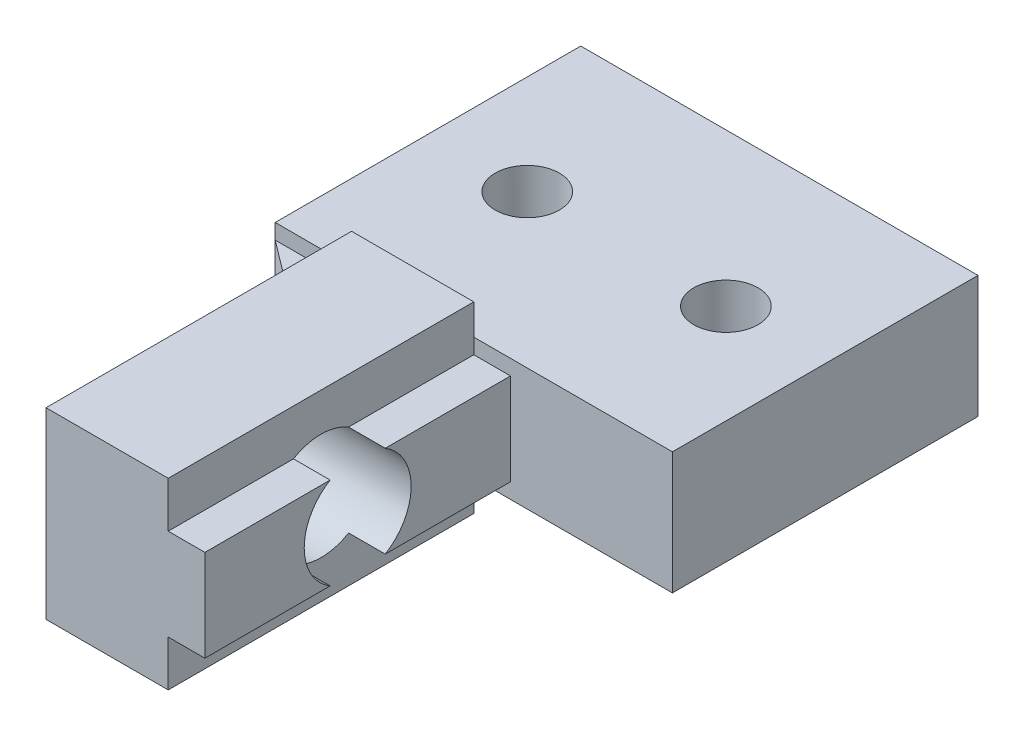
ISO-10303-21;
HEADER;
FILE_DESCRIPTION(('STEP AP214'),'2;1');
FILE_NAME('part.step','',(''),(''),'','','');
FILE_SCHEMA(('AUTOMOTIVE_DESIGN { 1 0 10303 214 1 1 1 1 }'));
ENDSEC;
DATA;
#1=APPLICATION_CONTEXT('core data for automotive mechanical design processes');
#2=APPLICATION_PROTOCOL_DEFINITION('international standard','automotive_design',2000,#1);
#3=PRODUCT_CONTEXT('',#1,'mechanical');
#4=PRODUCT('Part','Part','',(#3));
#5=PRODUCT_RELATED_PRODUCT_CATEGORY('part','',(#4));
#6=PRODUCT_DEFINITION_FORMATION('','',#4);
#7=PRODUCT_DEFINITION_CONTEXT('part definition',#1,'design');
#8=PRODUCT_DEFINITION('design','',#6,#7);
#9=PRODUCT_DEFINITION_SHAPE('','',#8);
#10=(LENGTH_UNIT() NAMED_UNIT(*) SI_UNIT(.MILLI.,.METRE.));
#11=(NAMED_UNIT(*) PLANE_ANGLE_UNIT() SI_UNIT($,.RADIAN.));
#12=(NAMED_UNIT(*) SI_UNIT($,.STERADIAN.) SOLID_ANGLE_UNIT());
#13=UNCERTAINTY_MEASURE_WITH_UNIT(LENGTH_MEASURE(1.E-05),#10,'distance_accuracy_value','');
#14=(GEOMETRIC_REPRESENTATION_CONTEXT(3) GLOBAL_UNCERTAINTY_ASSIGNED_CONTEXT((#13)) GLOBAL_UNIT_ASSIGNED_CONTEXT((#10,
#11,#12)) REPRESENTATION_CONTEXT('',''));
#15=CARTESIAN_POINT('',(0.,0.,0.));
#16=DIRECTION('',(0.,0.,1.));
#17=DIRECTION('',(1.,0.,0.));
#18=AXIS2_PLACEMENT_3D('',#15,#16,#17);
#19=CARTESIAN_POINT('',(-6.5,6.,5.));
#20=DIRECTION('',(0.,0.,-1.));
#21=DIRECTION('',(-1.,0.,0.));
#22=AXIS2_PLACEMENT_3D('',#19,#20,#21);
#23=PLANE('',#22);
#24=DIRECTION('',(-1.,0.,0.));
#25=VECTOR('',#24,1.);
#26=CARTESIAN_POINT('',(-6.5,4.5,5.));
#27=LINE('',#26,#25);
#28=CARTESIAN_POINT('',(-4.,4.5,5.));
#29=VERTEX_POINT('',#28);
#30=CARTESIAN_POINT('',(-6.5,4.5,5.));
#31=VERTEX_POINT('',#30);
#32=EDGE_CURVE('E195',#29,#31,#27,.T.);
#33=ORIENTED_EDGE('',*,*,#32,.F.);
#34=DIRECTION('',(0.,-1.,0.));
#35=VECTOR('',#34,1.);
#36=CARTESIAN_POINT('',(-4.,0.,5.));
#37=LINE('',#36,#35);
#38=CARTESIAN_POINT('',(-4.,5.,5.));
#39=VERTEX_POINT('',#38);
#40=EDGE_CURVE('E182',#39,#29,#37,.T.);
#41=ORIENTED_EDGE('',*,*,#40,.F.);
#42=DIRECTION('',(1.,0.,0.));
#43=VECTOR('',#42,1.);
#44=CARTESIAN_POINT('',(-6.5,5.,5.));
#45=LINE('',#44,#43);
#46=CARTESIAN_POINT('',(-6.5,5.,5.));
#47=VERTEX_POINT('',#46);
#48=EDGE_CURVE('E263',#47,#39,#45,.T.);
#49=ORIENTED_EDGE('',*,*,#48,.F.);
#50=DIRECTION('',(0.,-1.,0.));
#51=VECTOR('',#50,1.);
#52=CARTESIAN_POINT('',(-6.5,6.,5.));
#53=LINE('',#52,#51);
#54=EDGE_CURVE('E196',#47,#31,#53,.T.);
#55=ORIENTED_EDGE('',*,*,#54,.T.);
#56=EDGE_LOOP('',(#33,#41,#49,#55));
#57=FACE_BOUND('',#56,.T.);
#58=ADVANCED_FACE('F37',(#57),#23,.F.);
#59=CARTESIAN_POINT('',(1.2,1.5,15.));
#60=DIRECTION('',(0.,1.,0.));
#61=DIRECTION('',(-1.,0.,0.));
#62=AXIS2_PLACEMENT_3D('',#59,#60,#61);
#63=PLANE('',#62);
#64=DIRECTION('',(0.,0.,-1.));
#65=VECTOR('',#64,1.);
#66=CARTESIAN_POINT('',(1.2,1.5,15.));
#67=LINE('',#66,#65);
#68=CARTESIAN_POINT('',(1.2,1.5,9.09861218113401));
#69=VERTEX_POINT('',#68);
#70=CARTESIAN_POINT('',(1.2,1.5,5.));
#71=VERTEX_POINT('',#70);
#72=EDGE_CURVE('E321',#69,#71,#67,.T.);
#73=ORIENTED_EDGE('',*,*,#72,.F.);
#74=DIRECTION('',(-1.,0.,0.));
#75=VECTOR('',#74,1.);
#76=CARTESIAN_POINT('',(6.5,1.5,9.098612181134));
#77=LINE('',#76,#75);
#78=CARTESIAN_POINT('',(0.,1.5,9.098612181134));
#79=VERTEX_POINT('',#78);
#80=EDGE_CURVE('E231',#69,#79,#77,.T.);
#81=ORIENTED_EDGE('',*,*,#80,.T.);
#82=DIRECTION('',(0.,0.,-1.));
#83=VECTOR('',#82,1.);
#84=CARTESIAN_POINT('',(0.,1.5,15.));
#85=LINE('',#84,#83);
#86=CARTESIAN_POINT('',(0.,1.5,5.));
#87=VERTEX_POINT('',#86);
#88=EDGE_CURVE('E325',#79,#87,#85,.T.);
#89=ORIENTED_EDGE('',*,*,#88,.T.);
#90=DIRECTION('',(1.,0.,0.));
#91=VECTOR('',#90,1.);
#92=CARTESIAN_POINT('',(1.2,1.5,5.));
#93=LINE('',#92,#91);
#94=EDGE_CURVE('E299',#87,#71,#93,.T.);
#95=ORIENTED_EDGE('',*,*,#94,.T.);
#96=EDGE_LOOP('',(#73,#81,#89,#95));
#97=FACE_BOUND('',#96,.T.);
#98=ADVANCED_FACE('F410',(#97),#63,.F.);
#99=CARTESIAN_POINT('',(1.2,4.5,15.));
#100=DIRECTION('',(-1.,0.,0.));
#101=DIRECTION('',(0.,0.,1.));
#102=AXIS2_PLACEMENT_3D('',#99,#100,#101);
#103=PLANE('',#102);
#104=DIRECTION('',(0.,0.,-1.));
#105=VECTOR('',#104,1.);
#106=CARTESIAN_POINT('',(1.2,4.5,15.));
#107=LINE('',#106,#105);
#108=CARTESIAN_POINT('',(1.2,4.5,9.09861218113401));
#109=VERTEX_POINT('',#108);
#110=CARTESIAN_POINT('',(1.2,4.5,5.));
#111=VERTEX_POINT('',#110);
#112=EDGE_CURVE('E317',#109,#111,#107,.T.);
#113=ORIENTED_EDGE('',*,*,#112,.F.);
#114=CARTESIAN_POINT('',(1.2,3.,10.));
#115=DIRECTION('',(-1.,0.,0.));
#116=DIRECTION('',(0.,0.,1.));
#117=AXIS2_PLACEMENT_3D('',#114,#115,#116);
#118=CIRCLE('',#117,1.75);
#119=EDGE_CURVE('E227',#109,#69,#118,.T.);
#120=ORIENTED_EDGE('',*,*,#119,.T.);
#121=ORIENTED_EDGE('',*,*,#72,.T.);
#122=DIRECTION('',(0.,1.,0.));
#123=VECTOR('',#122,1.);
#124=CARTESIAN_POINT('',(1.2,4.5,5.));
#125=LINE('',#124,#123);
#126=EDGE_CURVE('E302',#71,#111,#125,.T.);
#127=ORIENTED_EDGE('',*,*,#126,.T.);
#128=EDGE_LOOP('',(#113,#120,#121,#127));
#129=FACE_BOUND('',#128,.T.);
#130=ADVANCED_FACE('F415',(#129),#103,.F.);
#131=CARTESIAN_POINT('',(0.,4.5,15.));
#132=DIRECTION('',(0.,-1.,0.));
#133=DIRECTION('',(0.,0.,-1.));
#134=AXIS2_PLACEMENT_3D('',#131,#132,#133);
#135=PLANE('',#134);
#136=CARTESIAN_POINT('',(1.2,4.5,15.));
#137=VERTEX_POINT('',#136);
#138=CARTESIAN_POINT('',(1.2,4.5,10.901387818866));
#139=VERTEX_POINT('',#138);
#140=EDGE_CURVE('E318',#137,#139,#107,.T.);
#141=ORIENTED_EDGE('',*,*,#140,.T.);
#142=DIRECTION('',(-1.,0.,0.));
#143=VECTOR('',#142,1.);
#144=CARTESIAN_POINT('',(6.5,4.5,10.901387818866));
#145=LINE('',#144,#143);
#146=CARTESIAN_POINT('',(0.,4.5,10.901387818866));
#147=VERTEX_POINT('',#146);
#148=EDGE_CURVE('E221',#139,#147,#145,.T.);
#149=ORIENTED_EDGE('',*,*,#148,.T.);
#150=DIRECTION('',(0.,0.,-1.));
#151=VECTOR('',#150,1.);
#152=CARTESIAN_POINT('',(0.,4.5,15.));
#153=LINE('',#152,#151);
#154=CARTESIAN_POINT('',(0.,4.5,15.));
#155=VERTEX_POINT('',#154);
#156=EDGE_CURVE('E314',#155,#147,#153,.T.);
#157=ORIENTED_EDGE('',*,*,#156,.F.);
#158=DIRECTION('',(-1.,0.,0.));
#159=VECTOR('',#158,1.);
#160=CARTESIAN_POINT('',(0.,4.5,15.));
#161=LINE('',#160,#159);
#162=EDGE_CURVE('E290',#137,#155,#161,.T.);
#163=ORIENTED_EDGE('',*,*,#162,.F.);
#164=EDGE_LOOP('',(#141,#149,#157,#163));
#165=FACE_BOUND('',#164,.T.);
#166=ADVANCED_FACE('F423',(#165),#135,.F.);
#167=DIRECTION('',(-1.,0.,0.));
#168=VECTOR('',#167,1.);
#169=CARTESIAN_POINT('',(-6.5,1.,5.));
#170=LINE('',#169,#168);
#171=CARTESIAN_POINT('',(6.5,1.,5.));
#172=VERTEX_POINT('',#171);
#173=CARTESIAN_POINT('',(0.,1.,5.));
#174=VERTEX_POINT('',#173);
#175=EDGE_CURVE('E248',#172,#174,#170,.T.);
#176=ORIENTED_EDGE('',*,*,#175,.F.);
#177=DIRECTION('',(0.,-1.,0.));
#178=VECTOR('',#177,1.);
#179=CARTESIAN_POINT('',(6.5,6.,5.));
#180=LINE('',#179,#178);
#181=CARTESIAN_POINT('',(6.5,5.,5.));
#182=VERTEX_POINT('',#181);
#183=EDGE_CURVE('E337',#182,#172,#180,.T.);
#184=ORIENTED_EDGE('',*,*,#183,.F.);
#185=CARTESIAN_POINT('',(0.,5.,5.));
#186=VERTEX_POINT('',#185);
#187=EDGE_CURVE('E262',#186,#182,#45,.T.);
#188=ORIENTED_EDGE('',*,*,#187,.F.);
#189=DIRECTION('',(0.,1.,0.));
#190=VECTOR('',#189,1.);
#191=CARTESIAN_POINT('',(0.,6.,5.));
#192=LINE('',#191,#190);
#193=CARTESIAN_POINT('',(0.,4.5,5.));
#194=VERTEX_POINT('',#193);
#195=EDGE_CURVE('E280',#194,#186,#192,.T.);
#196=ORIENTED_EDGE('',*,*,#195,.F.);
#197=DIRECTION('',(-1.,0.,0.));
#198=VECTOR('',#197,1.);
#199=CARTESIAN_POINT('',(0.,4.5,5.));
#200=LINE('',#199,#198);
#201=EDGE_CURVE('E305',#111,#194,#200,.T.);
#202=ORIENTED_EDGE('',*,*,#201,.F.);
#203=ORIENTED_EDGE('',*,*,#126,.F.);
#204=ORIENTED_EDGE('',*,*,#94,.F.);
#205=DIRECTION('',(0.,1.,0.));
#206=VECTOR('',#205,1.);
#207=CARTESIAN_POINT('',(0.,1.5,5.));
#208=LINE('',#207,#206);
#209=EDGE_CURVE('E295',#174,#87,#208,.T.);
#210=ORIENTED_EDGE('',*,*,#209,.F.);
#211=EDGE_LOOP('',(#176,#184,#188,#196,#202,#203,#204,#210));
#212=FACE_BOUND('',#211,.T.);
#213=ADVANCED_FACE('F376',(#212),#23,.F.);
#214=CARTESIAN_POINT('',(-4.,1.5,5.));
#215=VERTEX_POINT('',#214);
#216=CARTESIAN_POINT('',(-4.,1.,5.));
#217=VERTEX_POINT('',#216);
#218=EDGE_CURVE('E192',#215,#217,#37,.T.);
#219=ORIENTED_EDGE('',*,*,#218,.F.);
#220=DIRECTION('',(-1.,0.,0.));
#221=VECTOR('',#220,1.);
#222=CARTESIAN_POINT('',(-6.5,1.5,5.));
#223=LINE('',#222,#221);
#224=CARTESIAN_POINT('',(-6.5,1.5,5.));
#225=VERTEX_POINT('',#224);
#226=EDGE_CURVE('E52',#215,#225,#223,.T.);
#227=ORIENTED_EDGE('',*,*,#226,.T.);
#228=CARTESIAN_POINT('',(-6.5,1.,5.));
#229=VERTEX_POINT('',#228);
#230=EDGE_CURVE('E339',#225,#229,#53,.T.);
#231=ORIENTED_EDGE('',*,*,#230,.T.);
#232=EDGE_CURVE('E247',#217,#229,#170,.T.);
#233=ORIENTED_EDGE('',*,*,#232,.F.);
#234=EDGE_LOOP('',(#219,#227,#231,#233));
#235=FACE_BOUND('',#234,.T.);
#236=ADVANCED_FACE('F393',(#235),#23,.F.);
#237=CARTESIAN_POINT('',(6.5,6.,-5.));
#238=DIRECTION('',(-1.,0.,0.));
#239=DIRECTION('',(0.,0.,1.));
#240=AXIS2_PLACEMENT_3D('',#237,#238,#239);
#241=PLANE('',#240);
#242=DIRECTION('',(0.,0.,1.));
#243=VECTOR('',#242,1.);
#244=CARTESIAN_POINT('',(6.5,1.,5.));
#245=LINE('',#244,#243);
#246=CARTESIAN_POINT('',(6.5,1.,-5.));
#247=VERTEX_POINT('',#246);
#248=EDGE_CURVE('E244',#247,#172,#245,.T.);
#249=ORIENTED_EDGE('',*,*,#248,.F.);
#250=DIRECTION('',(0.,-1.,0.));
#251=VECTOR('',#250,1.);
#252=CARTESIAN_POINT('',(6.5,6.,-5.));
#253=LINE('',#252,#251);
#254=CARTESIAN_POINT('',(6.5,5.,-5.));
#255=VERTEX_POINT('',#254);
#256=EDGE_CURVE('E45',#255,#247,#253,.T.);
#257=ORIENTED_EDGE('',*,*,#256,.F.);
#258=DIRECTION('',(0.,0.,-1.));
#259=VECTOR('',#258,1.);
#260=CARTESIAN_POINT('',(6.5,5.,-5.));
#261=LINE('',#260,#259);
#262=EDGE_CURVE('E266',#182,#255,#261,.T.);
#263=ORIENTED_EDGE('',*,*,#262,.F.);
#264=ORIENTED_EDGE('',*,*,#183,.T.);
#265=EDGE_LOOP('',(#249,#257,#263,#264));
#266=FACE_BOUND('',#265,.T.);
#267=ADVANCED_FACE('F39',(#266),#241,.F.);
#268=CARTESIAN_POINT('',(-6.5,6.,-5.));
#269=DIRECTION('',(0.,0.,1.));
#270=DIRECTION('',(1.,0.,0.));
#271=AXIS2_PLACEMENT_3D('',#268,#269,#270);
#272=PLANE('',#271);
#273=DIRECTION('',(1.,0.,0.));
#274=VECTOR('',#273,1.);
#275=CARTESIAN_POINT('',(-6.5,1.,-5.));
#276=LINE('',#275,#274);
#277=CARTESIAN_POINT('',(-6.5,1.,-5.));
#278=VERTEX_POINT('',#277);
#279=EDGE_CURVE('E241',#278,#247,#276,.T.);
#280=ORIENTED_EDGE('',*,*,#279,.F.);
#281=DIRECTION('',(0.,-1.,0.));
#282=VECTOR('',#281,1.);
#283=CARTESIAN_POINT('',(-6.5,6.,-5.));
#284=LINE('',#283,#282);
#285=CARTESIAN_POINT('',(-6.5,5.,-5.));
#286=VERTEX_POINT('',#285);
#287=EDGE_CURVE('E341',#286,#278,#284,.T.);
#288=ORIENTED_EDGE('',*,*,#287,.F.);
#289=DIRECTION('',(-1.,0.,0.));
#290=VECTOR('',#289,1.);
#291=CARTESIAN_POINT('',(-6.5,5.,-5.));
#292=LINE('',#291,#290);
#293=EDGE_CURVE('E269',#255,#286,#292,.T.);
#294=ORIENTED_EDGE('',*,*,#293,.F.);
#295=ORIENTED_EDGE('',*,*,#256,.T.);
#296=EDGE_LOOP('',(#280,#288,#294,#295));
#297=FACE_BOUND('',#296,.T.);
#298=ADVANCED_FACE('F366',(#297),#272,.F.);
#299=CARTESIAN_POINT('',(-6.5,6.,-5.));
#300=DIRECTION('',(1.,0.,0.));
#301=DIRECTION('',(0.,0.,-1.));
#302=AXIS2_PLACEMENT_3D('',#299,#300,#301);
#303=PLANE('',#302);
#304=ORIENTED_EDGE('',*,*,#230,.F.);
#305=DIRECTION('',(0.,1.,0.));
#306=VECTOR('',#305,1.);
#307=CARTESIAN_POINT('',(-6.5,6.,5.));
#308=LINE('',#307,#306);
#309=EDGE_CURVE('E59',#31,#225,#308,.F.);
#310=ORIENTED_EDGE('',*,*,#309,.F.);
#311=ORIENTED_EDGE('',*,*,#54,.F.);
#312=DIRECTION('',(0.,0.,1.));
#313=VECTOR('',#312,1.);
#314=CARTESIAN_POINT('',(-6.5,5.,-5.));
#315=LINE('',#314,#313);
#316=EDGE_CURVE('E260',#286,#47,#315,.T.);
#317=ORIENTED_EDGE('',*,*,#316,.F.);
#318=ORIENTED_EDGE('',*,*,#287,.T.);
#319=DIRECTION('',(0.,0.,-1.));
#320=VECTOR('',#319,1.);
#321=CARTESIAN_POINT('',(-6.5,1.,5.));
#322=LINE('',#321,#320);
#323=EDGE_CURVE('E238',#229,#278,#322,.T.);
#324=ORIENTED_EDGE('',*,*,#323,.F.);
#325=EDGE_LOOP('',(#304,#310,#311,#317,#318,#324));
#326=FACE_BOUND('',#325,.T.);
#327=ADVANCED_FACE('F394',(#326),#303,.F.);
#328=CARTESIAN_POINT('',(-3.25,6.,0.));
#329=DIRECTION('',(0.,-1.,0.));
#330=DIRECTION('',(0.,0.,-1.));
#331=AXIS2_PLACEMENT_3D('',#328,#329,#330);
#332=CYLINDRICAL_SURFACE('',#331,1.05);
#333=CARTESIAN_POINT('',(-3.25,1.,0.));
#334=DIRECTION('',(0.,-1.,0.));
#335=DIRECTION('',(0.,0.,-1.));
#336=AXIS2_PLACEMENT_3D('',#333,#334,#335);
#337=CIRCLE('',#336,1.05);
#338=CARTESIAN_POINT('',(-3.25,1.,-1.05));
#339=VERTEX_POINT('',#338);
#340=EDGE_CURVE('E256',#339,#339,#337,.T.);
#341=ORIENTED_EDGE('',*,*,#340,.T.);
#342=EDGE_LOOP('',(#341));
#343=FACE_BOUND('',#342,.T.);
#344=CARTESIAN_POINT('',(-3.25,5.,0.));
#345=DIRECTION('',(0.,1.,0.));
#346=DIRECTION('',(0.,0.,1.));
#347=AXIS2_PLACEMENT_3D('',#344,#345,#346);
#348=CIRCLE('',#347,1.05);
#349=CARTESIAN_POINT('',(-3.25,5.,1.05));
#350=VERTEX_POINT('',#349);
#351=EDGE_CURVE('E273',#350,#350,#348,.T.);
#352=ORIENTED_EDGE('',*,*,#351,.T.);
#353=EDGE_LOOP('',(#352));
#354=FACE_BOUND('',#353,.T.);
#355=ADVANCED_FACE('F487',(#343,#354),#332,.F.);
#356=CARTESIAN_POINT('',(3.25,6.,0.));
#357=DIRECTION('',(0.,-1.,0.));
#358=DIRECTION('',(0.,0.,-1.));
#359=AXIS2_PLACEMENT_3D('',#356,#357,#358);
#360=CYLINDRICAL_SURFACE('',#359,1.05);
#361=CARTESIAN_POINT('',(3.25,1.,0.));
#362=DIRECTION('',(0.,-1.,0.));
#363=DIRECTION('',(0.,0.,-1.));
#364=AXIS2_PLACEMENT_3D('',#361,#362,#363);
#365=CIRCLE('',#364,1.05);
#366=CARTESIAN_POINT('',(3.25,1.,-1.05));
#367=VERTEX_POINT('',#366);
#368=EDGE_CURVE('E255',#367,#367,#365,.T.);
#369=ORIENTED_EDGE('',*,*,#368,.T.);
#370=EDGE_LOOP('',(#369));
#371=FACE_BOUND('',#370,.T.);
#372=CARTESIAN_POINT('',(3.25,5.,0.));
#373=DIRECTION('',(0.,1.,0.));
#374=DIRECTION('',(0.,0.,1.));
#375=AXIS2_PLACEMENT_3D('',#372,#373,#374);
#376=CIRCLE('',#375,1.05);
#377=CARTESIAN_POINT('',(3.25,5.,1.05));
#378=VERTEX_POINT('',#377);
#379=EDGE_CURVE('E271',#378,#378,#376,.T.);
#380=ORIENTED_EDGE('',*,*,#379,.T.);
#381=EDGE_LOOP('',(#380));
#382=FACE_BOUND('',#381,.T.);
#383=ADVANCED_FACE('F348',(#371,#382),#360,.F.);
#384=CARTESIAN_POINT('',(0.,6.,0.));
#385=DIRECTION('',(0.,1.,0.));
#386=DIRECTION('',(0.,0.,1.));
#387=AXIS2_PLACEMENT_3D('',#384,#385,#386);
#388=PLANE('',#387);
#389=DIRECTION('',(1.,0.,0.));
#390=VECTOR('',#389,1.);
#391=CARTESIAN_POINT('',(-6.5,6.,5.));
#392=LINE('',#391,#390);
#393=CARTESIAN_POINT('',(-4.,6.,5.));
#394=VERTEX_POINT('',#393);
#395=CARTESIAN_POINT('',(0.,6.,5.));
#396=VERTEX_POINT('',#395);
#397=EDGE_CURVE('E259',#394,#396,#392,.T.);
#398=ORIENTED_EDGE('',*,*,#397,.F.);
#399=DIRECTION('',(0.,0.,-1.));
#400=VECTOR('',#399,1.);
#401=CARTESIAN_POINT('',(-4.,6.,15.));
#402=LINE('',#401,#400);
#403=CARTESIAN_POINT('',(-4.,6.,15.));
#404=VERTEX_POINT('',#403);
#405=EDGE_CURVE('E335',#404,#394,#402,.T.);
#406=ORIENTED_EDGE('',*,*,#405,.F.);
#407=DIRECTION('',(-1.,0.,0.));
#408=VECTOR('',#407,1.);
#409=CARTESIAN_POINT('',(-4.,6.,15.));
#410=LINE('',#409,#408);
#411=CARTESIAN_POINT('',(0.,6.,15.));
#412=VERTEX_POINT('',#411);
#413=EDGE_CURVE('E276',#412,#404,#410,.T.);
#414=ORIENTED_EDGE('',*,*,#413,.F.);
#415=DIRECTION('',(0.,0.,-1.));
#416=VECTOR('',#415,1.);
#417=CARTESIAN_POINT('',(0.,6.,15.));
#418=LINE('',#417,#416);
#419=EDGE_CURVE('E293',#412,#396,#418,.T.);
#420=ORIENTED_EDGE('',*,*,#419,.T.);
#421=EDGE_LOOP('',(#398,#406,#414,#420));
#422=FACE_BOUND('',#421,.T.);
#423=ADVANCED_FACE('F462',(#422),#388,.T.);
#424=CARTESIAN_POINT('',(0.,0.,0.));
#425=DIRECTION('',(0.,1.,0.));
#426=DIRECTION('',(0.,0.,1.));
#427=AXIS2_PLACEMENT_3D('',#424,#425,#426);
#428=PLANE('',#427);
#429=DIRECTION('',(0.,0.,-1.));
#430=VECTOR('',#429,1.);
#431=CARTESIAN_POINT('',(-4.,0.,15.));
#432=LINE('',#431,#430);
#433=CARTESIAN_POINT('',(-4.,0.,15.));
#434=VERTEX_POINT('',#433);
#435=CARTESIAN_POINT('',(-4.,0.,5.));
#436=VERTEX_POINT('',#435);
#437=EDGE_CURVE('E332',#434,#436,#432,.T.);
#438=ORIENTED_EDGE('',*,*,#437,.T.);
#439=DIRECTION('',(-1.,0.,0.));
#440=VECTOR('',#439,1.);
#441=CARTESIAN_POINT('',(-6.5,0.,5.));
#442=LINE('',#441,#440);
#443=CARTESIAN_POINT('',(0.,0.,5.));
#444=VERTEX_POINT('',#443);
#445=EDGE_CURVE('E237',#444,#436,#442,.T.);
#446=ORIENTED_EDGE('',*,*,#445,.F.);
#447=DIRECTION('',(0.,0.,-1.));
#448=VECTOR('',#447,1.);
#449=CARTESIAN_POINT('',(0.,0.,15.));
#450=LINE('',#449,#448);
#451=CARTESIAN_POINT('',(0.,0.,15.));
#452=VERTEX_POINT('',#451);
#453=EDGE_CURVE('E329',#452,#444,#450,.T.);
#454=ORIENTED_EDGE('',*,*,#453,.F.);
#455=DIRECTION('',(1.,0.,0.));
#456=VECTOR('',#455,1.);
#457=CARTESIAN_POINT('',(0.,0.,15.));
#458=LINE('',#457,#456);
#459=EDGE_CURVE('E282',#434,#452,#458,.T.);
#460=ORIENTED_EDGE('',*,*,#459,.F.);
#461=EDGE_LOOP('',(#438,#446,#454,#460));
#462=FACE_BOUND('',#461,.T.);
#463=ADVANCED_FACE('F390',(#462),#428,.F.);
#464=CARTESIAN_POINT('',(-4.,0.,15.));
#465=DIRECTION('',(1.,0.,0.));
#466=DIRECTION('',(0.,0.,-1.));
#467=AXIS2_PLACEMENT_3D('',#464,#465,#466);
#468=PLANE('',#467);
#469=CARTESIAN_POINT('',(-4.,3.,10.));
#470=DIRECTION('',(-1.,0.,0.));
#471=DIRECTION('',(0.,0.,1.));
#472=AXIS2_PLACEMENT_3D('',#469,#470,#471);
#473=CIRCLE('',#472,1.75);
#474=CARTESIAN_POINT('',(-4.,3.,11.75));
#475=VERTEX_POINT('',#474);
#476=EDGE_CURVE('E215',#475,#475,#473,.T.);
#477=ORIENTED_EDGE('',*,*,#476,.F.);
#478=EDGE_LOOP('',(#477));
#479=FACE_BOUND('',#478,.T.);
#480=DIRECTION('',(0.,1.,0.));
#481=VECTOR('',#480,1.);
#482=CARTESIAN_POINT('',(-4.,0.,6.8838172143846));
#483=LINE('',#482,#481);
#484=CARTESIAN_POINT('',(-4.,4.5,6.8838172143846));
#485=VERTEX_POINT('',#484);
#486=CARTESIAN_POINT('',(-4.,1.5,6.8838172143846));
#487=VERTEX_POINT('',#486);
#488=EDGE_CURVE('E212',#485,#487,#483,.F.);
#489=ORIENTED_EDGE('',*,*,#488,.T.);
#490=DIRECTION('',(0.,0.,-1.));
#491=VECTOR('',#490,1.);
#492=CARTESIAN_POINT('',(-4.,1.5,15.));
#493=LINE('',#492,#491);
#494=EDGE_CURVE('E200',#487,#215,#493,.T.);
#495=ORIENTED_EDGE('',*,*,#494,.T.);
#496=ORIENTED_EDGE('',*,*,#218,.T.);
#497=DIRECTION('',(0.,-1.,0.));
#498=VECTOR('',#497,1.);
#499=CARTESIAN_POINT('',(-4.,0.,5.));
#500=LINE('',#499,#498);
#501=EDGE_CURVE('E250',#217,#436,#500,.T.);
#502=ORIENTED_EDGE('',*,*,#501,.T.);
#503=ORIENTED_EDGE('',*,*,#437,.F.);
#504=DIRECTION('',(0.,-1.,0.));
#505=VECTOR('',#504,1.);
#506=CARTESIAN_POINT('',(-4.,0.,15.));
#507=LINE('',#506,#505);
#508=EDGE_CURVE('E279',#404,#434,#507,.T.);
#509=ORIENTED_EDGE('',*,*,#508,.F.);
#510=ORIENTED_EDGE('',*,*,#405,.T.);
#511=EDGE_CURVE('E189',#394,#39,#37,.T.);
#512=ORIENTED_EDGE('',*,*,#511,.T.);
#513=ORIENTED_EDGE('',*,*,#40,.T.);
#514=DIRECTION('',(0.,0.,-1.));
#515=VECTOR('',#514,1.);
#516=CARTESIAN_POINT('',(-4.,4.5,15.));
#517=LINE('',#516,#515);
#518=EDGE_CURVE('E186',#485,#29,#517,.T.);
#519=ORIENTED_EDGE('',*,*,#518,.F.);
#520=EDGE_LOOP('',(#489,#495,#496,#502,#503,#509,#510,#512,#513,#519));
#521=FACE_BOUND('',#520,.T.);
#522=ADVANCED_FACE('F184',(#479,#521),#468,.F.);
#523=CARTESIAN_POINT('',(0.,1.5,15.));
#524=DIRECTION('',(-1.,0.,0.));
#525=DIRECTION('',(0.,-1.,0.));
#526=AXIS2_PLACEMENT_3D('',#523,#524,#525);
#527=PLANE('',#526);
#528=ORIENTED_EDGE('',*,*,#88,.F.);
#529=CARTESIAN_POINT('',(0.,3.,10.));
#530=DIRECTION('',(-1.,0.,0.));
#531=DIRECTION('',(0.,-1.,0.));
#532=AXIS2_PLACEMENT_3D('',#529,#530,#531);
#533=CIRCLE('',#532,1.75);
#534=CARTESIAN_POINT('',(0.,1.5,10.901387818866));
#535=VERTEX_POINT('',#534);
#536=EDGE_CURVE('E234',#79,#535,#533,.T.);
#537=ORIENTED_EDGE('',*,*,#536,.T.);
#538=CARTESIAN_POINT('',(0.,1.5,15.));
#539=VERTEX_POINT('',#538);
#540=EDGE_CURVE('E326',#539,#535,#85,.T.);
#541=ORIENTED_EDGE('',*,*,#540,.F.);
#542=DIRECTION('',(0.,1.,0.));
#543=VECTOR('',#542,1.);
#544=CARTESIAN_POINT('',(0.,1.5,15.));
#545=LINE('',#544,#543);
#546=EDGE_CURVE('E284',#452,#539,#545,.T.);
#547=ORIENTED_EDGE('',*,*,#546,.F.);
#548=ORIENTED_EDGE('',*,*,#453,.T.);
#549=EDGE_CURVE('E296',#444,#174,#208,.T.);
#550=ORIENTED_EDGE('',*,*,#549,.T.);
#551=ORIENTED_EDGE('',*,*,#209,.T.);
#552=EDGE_LOOP('',(#528,#537,#541,#547,#548,#550,#551));
#553=FACE_BOUND('',#552,.T.);
#554=ADVANCED_FACE('F383',(#553),#527,.F.);
#555=ORIENTED_EDGE('',*,*,#540,.T.);
#556=DIRECTION('',(-1.,0.,0.));
#557=VECTOR('',#556,1.);
#558=CARTESIAN_POINT('',(6.5,1.5,10.901387818866));
#559=LINE('',#558,#557);
#560=CARTESIAN_POINT('',(1.2,1.5,10.901387818866));
#561=VERTEX_POINT('',#560);
#562=EDGE_CURVE('E228',#535,#561,#559,.F.);
#563=ORIENTED_EDGE('',*,*,#562,.T.);
#564=CARTESIAN_POINT('',(1.2,1.5,15.));
#565=VERTEX_POINT('',#564);
#566=EDGE_CURVE('E322',#565,#561,#67,.T.);
#567=ORIENTED_EDGE('',*,*,#566,.F.);
#568=DIRECTION('',(1.,0.,0.));
#569=VECTOR('',#568,1.);
#570=CARTESIAN_POINT('',(1.2,1.5,15.));
#571=LINE('',#570,#569);
#572=EDGE_CURVE('E286',#539,#565,#571,.T.);
#573=ORIENTED_EDGE('',*,*,#572,.F.);
#574=EDGE_LOOP('',(#555,#563,#567,#573));
#575=FACE_BOUND('',#574,.T.);
#576=ADVANCED_FACE('F418',(#575),#63,.F.);
#577=ORIENTED_EDGE('',*,*,#566,.T.);
#578=EDGE_CURVE('E224',#561,#139,#118,.T.);
#579=ORIENTED_EDGE('',*,*,#578,.T.);
#580=ORIENTED_EDGE('',*,*,#140,.F.);
#581=DIRECTION('',(0.,1.,0.));
#582=VECTOR('',#581,1.);
#583=CARTESIAN_POINT('',(1.2,4.5,15.));
#584=LINE('',#583,#582);
#585=EDGE_CURVE('E288',#565,#137,#584,.T.);
#586=ORIENTED_EDGE('',*,*,#585,.F.);
#587=EDGE_LOOP('',(#577,#579,#580,#586));
#588=FACE_BOUND('',#587,.T.);
#589=ADVANCED_FACE('F435',(#588),#103,.F.);
#590=CARTESIAN_POINT('',(0.,4.5,9.09861218113401));
#591=VERTEX_POINT('',#590);
#592=EDGE_CURVE('E313',#591,#194,#153,.T.);
#593=ORIENTED_EDGE('',*,*,#592,.F.);
#594=DIRECTION('',(-1.,0.,0.));
#595=VECTOR('',#594,1.);
#596=CARTESIAN_POINT('',(6.5,4.5,9.09861218113401));
#597=LINE('',#596,#595);
#598=EDGE_CURVE('E218',#591,#109,#597,.F.);
#599=ORIENTED_EDGE('',*,*,#598,.T.);
#600=ORIENTED_EDGE('',*,*,#112,.T.);
#601=ORIENTED_EDGE('',*,*,#201,.T.);
#602=EDGE_LOOP('',(#593,#599,#600,#601));
#603=FACE_BOUND('',#602,.T.);
#604=ADVANCED_FACE('F429',(#603),#135,.F.);
#605=CARTESIAN_POINT('',(0.,6.,15.));
#606=DIRECTION('',(-1.,0.,0.));
#607=DIRECTION('',(0.,-1.,0.));
#608=AXIS2_PLACEMENT_3D('',#605,#606,#607);
#609=PLANE('',#608);
#610=ORIENTED_EDGE('',*,*,#156,.T.);
#611=CARTESIAN_POINT('',(0.,3.,10.));
#612=DIRECTION('',(-1.,0.,0.));
#613=DIRECTION('',(0.,-1.,0.));
#614=AXIS2_PLACEMENT_3D('',#611,#612,#613);
#615=CIRCLE('',#614,1.75);
#616=EDGE_CURVE('E11',#147,#591,#615,.T.);
#617=ORIENTED_EDGE('',*,*,#616,.T.);
#618=ORIENTED_EDGE('',*,*,#592,.T.);
#619=ORIENTED_EDGE('',*,*,#195,.T.);
#620=EDGE_CURVE('E308',#186,#396,#192,.T.);
#621=ORIENTED_EDGE('',*,*,#620,.T.);
#622=ORIENTED_EDGE('',*,*,#419,.F.);
#623=DIRECTION('',(0.,1.,0.));
#624=VECTOR('',#623,1.);
#625=CARTESIAN_POINT('',(0.,6.,15.));
#626=LINE('',#625,#624);
#627=EDGE_CURVE('E292',#155,#412,#626,.T.);
#628=ORIENTED_EDGE('',*,*,#627,.F.);
#629=EDGE_LOOP('',(#610,#617,#618,#619,#621,#622,#628));
#630=FACE_BOUND('',#629,.T.);
#631=ADVANCED_FACE('F438',(#630),#609,.F.);
#632=CARTESIAN_POINT('',(0.,0.,15.));
#633=DIRECTION('',(0.,0.,-1.));
#634=DIRECTION('',(-1.,0.,0.));
#635=AXIS2_PLACEMENT_3D('',#632,#633,#634);
#636=PLANE('',#635);
#637=ORIENTED_EDGE('',*,*,#413,.T.);
#638=ORIENTED_EDGE('',*,*,#508,.T.);
#639=ORIENTED_EDGE('',*,*,#459,.T.);
#640=ORIENTED_EDGE('',*,*,#546,.T.);
#641=ORIENTED_EDGE('',*,*,#572,.T.);
#642=ORIENTED_EDGE('',*,*,#585,.T.);
#643=ORIENTED_EDGE('',*,*,#162,.T.);
#644=ORIENTED_EDGE('',*,*,#627,.T.);
#645=EDGE_LOOP('',(#637,#638,#639,#640,#641,#642,#643,#644));
#646=FACE_BOUND('',#645,.T.);
#647=ADVANCED_FACE('F444',(#646),#636,.F.);
#648=CARTESIAN_POINT('',(-6.5,5.,5.));
#649=DIRECTION('',(0.,0.,1.));
#650=DIRECTION('',(1.,0.,0.));
#651=AXIS2_PLACEMENT_3D('',#648,#649,#650);
#652=PLANE('',#651);
#653=ORIENTED_EDGE('',*,*,#397,.T.);
#654=ORIENTED_EDGE('',*,*,#620,.F.);
#655=EDGE_CURVE('E267',#39,#186,#45,.T.);
#656=ORIENTED_EDGE('',*,*,#655,.F.);
#657=ORIENTED_EDGE('',*,*,#511,.F.);
#658=EDGE_LOOP('',(#653,#654,#656,#657));
#659=FACE_BOUND('',#658,.T.);
#660=ADVANCED_FACE('F456',(#659),#652,.F.);
#661=CARTESIAN_POINT('',(0.,5.,0.));
#662=DIRECTION('',(0.,1.,0.));
#663=DIRECTION('',(0.,0.,1.));
#664=AXIS2_PLACEMENT_3D('',#661,#662,#663);
#665=PLANE('',#664);
#666=ORIENTED_EDGE('',*,*,#351,.F.);
#667=EDGE_LOOP('',(#666));
#668=FACE_BOUND('',#667,.T.);
#669=ORIENTED_EDGE('',*,*,#379,.F.);
#670=EDGE_LOOP('',(#669));
#671=FACE_BOUND('',#670,.T.);
#672=ORIENTED_EDGE('',*,*,#316,.T.);
#673=ORIENTED_EDGE('',*,*,#48,.T.);
#674=ORIENTED_EDGE('',*,*,#655,.T.);
#675=ORIENTED_EDGE('',*,*,#187,.T.);
#676=ORIENTED_EDGE('',*,*,#262,.T.);
#677=ORIENTED_EDGE('',*,*,#293,.T.);
#678=EDGE_LOOP('',(#672,#673,#674,#675,#676,#677));
#679=FACE_BOUND('',#678,.T.);
#680=ADVANCED_FACE('F454',(#668,#671,#679),#665,.T.);
#681=CARTESIAN_POINT('',(-6.5,1.,5.));
#682=DIRECTION('',(0.,0.,1.));
#683=DIRECTION('',(1.,0.,0.));
#684=AXIS2_PLACEMENT_3D('',#681,#682,#683);
#685=PLANE('',#684);
#686=EDGE_CURVE('E251',#174,#217,#170,.T.);
#687=ORIENTED_EDGE('',*,*,#686,.F.);
#688=ORIENTED_EDGE('',*,*,#549,.F.);
#689=ORIENTED_EDGE('',*,*,#445,.T.);
#690=ORIENTED_EDGE('',*,*,#501,.F.);
#691=EDGE_LOOP('',(#687,#688,#689,#690));
#692=FACE_BOUND('',#691,.T.);
#693=ADVANCED_FACE('F355',(#692),#685,.F.);
#694=CARTESIAN_POINT('',(0.,1.,0.));
#695=DIRECTION('',(0.,-1.,0.));
#696=DIRECTION('',(0.,0.,-1.));
#697=AXIS2_PLACEMENT_3D('',#694,#695,#696);
#698=PLANE('',#697);
#699=ORIENTED_EDGE('',*,*,#340,.F.);
#700=EDGE_LOOP('',(#699));
#701=FACE_BOUND('',#700,.T.);
#702=ORIENTED_EDGE('',*,*,#368,.F.);
#703=EDGE_LOOP('',(#702));
#704=FACE_BOUND('',#703,.T.);
#705=ORIENTED_EDGE('',*,*,#323,.T.);
#706=ORIENTED_EDGE('',*,*,#279,.T.);
#707=ORIENTED_EDGE('',*,*,#248,.T.);
#708=ORIENTED_EDGE('',*,*,#175,.T.);
#709=ORIENTED_EDGE('',*,*,#686,.T.);
#710=ORIENTED_EDGE('',*,*,#232,.T.);
#711=EDGE_LOOP('',(#705,#706,#707,#708,#709,#710));
#712=FACE_BOUND('',#711,.T.);
#713=ADVANCED_FACE('F351',(#701,#704,#712),#698,.T.);
#714=CARTESIAN_POINT('',(6.5,3.,10.));
#715=DIRECTION('',(-1.,0.,0.));
#716=DIRECTION('',(0.,0.,1.));
#717=AXIS2_PLACEMENT_3D('',#714,#715,#716);
#718=CYLINDRICAL_SURFACE('',#717,1.75);
#719=ORIENTED_EDGE('',*,*,#476,.T.);
#720=EDGE_LOOP('',(#719));
#721=FACE_BOUND('',#720,.T.);
#722=ORIENTED_EDGE('',*,*,#536,.F.);
#723=ORIENTED_EDGE('',*,*,#80,.F.);
#724=ORIENTED_EDGE('',*,*,#119,.F.);
#725=ORIENTED_EDGE('',*,*,#598,.F.);
#726=ORIENTED_EDGE('',*,*,#616,.F.);
#727=ORIENTED_EDGE('',*,*,#148,.F.);
#728=ORIENTED_EDGE('',*,*,#578,.F.);
#729=ORIENTED_EDGE('',*,*,#562,.F.);
#730=EDGE_LOOP('',(#722,#723,#724,#725,#726,#727,#728,#729));
#731=FACE_BOUND('',#730,.T.);
#732=ADVANCED_FACE('F354',(#721,#731),#718,.F.);
#733=CARTESIAN_POINT('',(-6.5,1.5,5.));
#734=DIRECTION('',(0.601801185778806,0.,-0.798645937067999));
#735=DIRECTION('',(0.798645937067999,0.,0.601801185778806));
#736=AXIS2_PLACEMENT_3D('',#733,#734,#735);
#737=PLANE('',#736);
#738=DIRECTION('',(0.798645937067999,0.,0.601801185778806));
#739=VECTOR('',#738,1.);
#740=CARTESIAN_POINT('',(-6.5,4.5,5.));
#741=LINE('',#740,#739);
#742=EDGE_CURVE('E203',#31,#485,#741,.T.);
#743=ORIENTED_EDGE('',*,*,#742,.F.);
#744=ORIENTED_EDGE('',*,*,#309,.T.);
#745=DIRECTION('',(0.798645937067999,0.,0.601801185778806));
#746=VECTOR('',#745,1.);
#747=CARTESIAN_POINT('',(-6.5,1.5,5.));
#748=LINE('',#747,#746);
#749=EDGE_CURVE('E204',#225,#487,#748,.T.);
#750=ORIENTED_EDGE('',*,*,#749,.T.);
#751=ORIENTED_EDGE('',*,*,#488,.F.);
#752=EDGE_LOOP('',(#743,#744,#750,#751));
#753=FACE_BOUND('',#752,.T.);
#754=ADVANCED_FACE('F397',(#753),#737,.F.);
#755=CARTESIAN_POINT('',(0.,1.5,5.));
#756=DIRECTION('',(0.,-1.,0.));
#757=DIRECTION('',(1.,0.,0.));
#758=AXIS2_PLACEMENT_3D('',#755,#756,#757);
#759=PLANE('',#758);
#760=ORIENTED_EDGE('',*,*,#749,.F.);
#761=ORIENTED_EDGE('',*,*,#226,.F.);
#762=ORIENTED_EDGE('',*,*,#494,.F.);
#763=EDGE_LOOP('',(#760,#761,#762));
#764=FACE_BOUND('',#763,.T.);
#765=ADVANCED_FACE('F400',(#764),#759,.T.);
#766=CARTESIAN_POINT('',(0.,4.5,5.));
#767=DIRECTION('',(0.,-1.,0.));
#768=DIRECTION('',(1.,0.,0.));
#769=AXIS2_PLACEMENT_3D('',#766,#767,#768);
#770=PLANE('',#769);
#771=ORIENTED_EDGE('',*,*,#518,.T.);
#772=ORIENTED_EDGE('',*,*,#32,.T.);
#773=ORIENTED_EDGE('',*,*,#742,.T.);
#774=EDGE_LOOP('',(#771,#772,#773));
#775=FACE_BOUND('',#774,.T.);
#776=ADVANCED_FACE('F202',(#775),#770,.F.);
#777=CLOSED_SHELL('',(#58,#98,#130,#166,#213,#236,#267,#298,#327,#355,#383,#423,#463,#522,#554,
#576,#589,#604,#631,#647,#660,#680,#693,#713,#732,#754,#765,#776));
#778=MANIFOLD_SOLID_BREP('B2',#777);
#779=ADVANCED_BREP_SHAPE_REPRESENTATION('',(#18,#778),#14);
#780=SHAPE_DEFINITION_REPRESENTATION(#9,#779);
ENDSEC;
END-ISO-10303-21;
